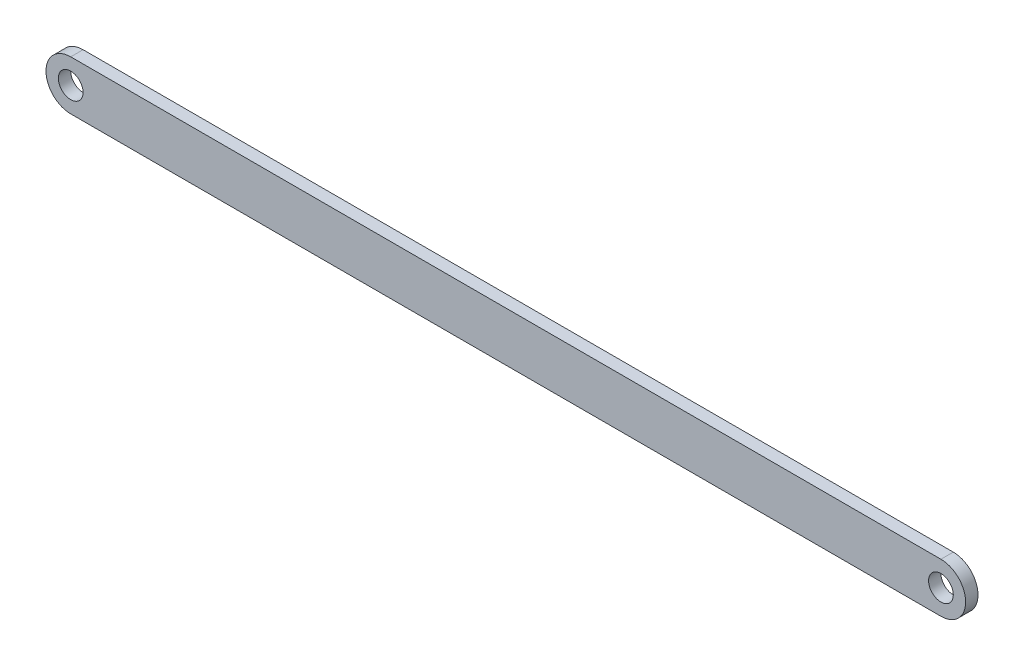
ISO-10303-21;
HEADER;
FILE_DESCRIPTION(('STEP AP214'),'2;1');
FILE_NAME('part.step','',(''),(''),'','','');
FILE_SCHEMA(('AUTOMOTIVE_DESIGN { 1 0 10303 214 1 1 1 1 }'));
ENDSEC;
DATA;
#1=APPLICATION_CONTEXT('core data for automotive mechanical design processes');
#2=APPLICATION_PROTOCOL_DEFINITION('international standard','automotive_design',2000,#1);
#3=PRODUCT_CONTEXT('',#1,'mechanical');
#4=PRODUCT('Part','Part','',(#3));
#5=PRODUCT_RELATED_PRODUCT_CATEGORY('part','',(#4));
#6=PRODUCT_DEFINITION_FORMATION('','',#4);
#7=PRODUCT_DEFINITION_CONTEXT('part definition',#1,'design');
#8=PRODUCT_DEFINITION('design','',#6,#7);
#9=PRODUCT_DEFINITION_SHAPE('','',#8);
#10=(LENGTH_UNIT() NAMED_UNIT(*) SI_UNIT(.MILLI.,.METRE.));
#11=(NAMED_UNIT(*) PLANE_ANGLE_UNIT() SI_UNIT($,.RADIAN.));
#12=(NAMED_UNIT(*) SI_UNIT($,.STERADIAN.) SOLID_ANGLE_UNIT());
#13=UNCERTAINTY_MEASURE_WITH_UNIT(LENGTH_MEASURE(1.E-05),#10,'distance_accuracy_value','');
#14=(GEOMETRIC_REPRESENTATION_CONTEXT(3) GLOBAL_UNCERTAINTY_ASSIGNED_CONTEXT((#13)) GLOBAL_UNIT_ASSIGNED_CONTEXT((#10,
#11,#12)) REPRESENTATION_CONTEXT('',''));
#15=CARTESIAN_POINT('',(0.,0.,0.));
#16=DIRECTION('',(0.,0.,1.));
#17=DIRECTION('',(1.,0.,0.));
#18=AXIS2_PLACEMENT_3D('',#15,#16,#17);
#19=CARTESIAN_POINT('',(35.21,0.,1.));
#20=DIRECTION('',(0.,0.,-1.));
#21=DIRECTION('',(-1.,0.,0.));
#22=AXIS2_PLACEMENT_3D('',#19,#20,#21);
#23=PLANE('',#22);
#24=CARTESIAN_POINT('',(35.21,0.,1.));
#25=DIRECTION('',(0.,0.,1.));
#26=DIRECTION('',(-1.,0.,0.));
#27=AXIS2_PLACEMENT_3D('',#24,#25,#26);
#28=CIRCLE('',#27,2.);
#29=CARTESIAN_POINT('',(35.21,-2.,1.));
#30=VERTEX_POINT('',#29);
#31=CARTESIAN_POINT('',(35.21,2.,1.));
#32=VERTEX_POINT('',#31);
#33=EDGE_CURVE('E92',#30,#32,#28,.T.);
#34=ORIENTED_EDGE('',*,*,#33,.T.);
#35=DIRECTION('',(-1.,0.,0.));
#36=VECTOR('',#35,1.);
#37=CARTESIAN_POINT('',(-35.21,2.,1.));
#38=LINE('',#37,#36);
#39=CARTESIAN_POINT('',(-35.21,2.,1.));
#40=VERTEX_POINT('',#39);
#41=EDGE_CURVE('E87',#32,#40,#38,.T.);
#42=ORIENTED_EDGE('',*,*,#41,.T.);
#43=CARTESIAN_POINT('',(-35.21,0.,1.));
#44=DIRECTION('',(0.,0.,1.));
#45=DIRECTION('',(1.,0.,0.));
#46=AXIS2_PLACEMENT_3D('',#43,#44,#45);
#47=CIRCLE('',#46,2.);
#48=CARTESIAN_POINT('',(-35.21,-2.,1.));
#49=VERTEX_POINT('',#48);
#50=EDGE_CURVE('E90',#40,#49,#47,.T.);
#51=ORIENTED_EDGE('',*,*,#50,.T.);
#52=DIRECTION('',(1.,0.,0.));
#53=VECTOR('',#52,1.);
#54=CARTESIAN_POINT('',(-35.21,-2.,1.));
#55=LINE('',#54,#53);
#56=EDGE_CURVE('E57',#49,#30,#55,.T.);
#57=ORIENTED_EDGE('',*,*,#56,.T.);
#58=EDGE_LOOP('',(#34,#42,#51,#57));
#59=FACE_BOUND('',#58,.T.);
#60=CARTESIAN_POINT('',(-35.21,0.,1.));
#61=DIRECTION('',(0.,0.,1.));
#62=DIRECTION('',(1.,0.,0.));
#63=AXIS2_PLACEMENT_3D('',#60,#61,#62);
#64=CIRCLE('',#63,0.999999999999998);
#65=CARTESIAN_POINT('',(-34.21,0.,1.));
#66=VERTEX_POINT('',#65);
#67=EDGE_CURVE('E107',#66,#66,#64,.T.);
#68=ORIENTED_EDGE('',*,*,#67,.F.);
#69=EDGE_LOOP('',(#68));
#70=FACE_BOUND('',#69,.T.);
#71=CARTESIAN_POINT('',(35.21,0.,1.));
#72=DIRECTION('',(0.,0.,1.));
#73=DIRECTION('',(1.,0.,0.));
#74=AXIS2_PLACEMENT_3D('',#71,#72,#73);
#75=CIRCLE('',#74,0.999999999999998);
#76=CARTESIAN_POINT('',(36.21,0.,1.));
#77=VERTEX_POINT('',#76);
#78=EDGE_CURVE('E122',#77,#77,#75,.T.);
#79=ORIENTED_EDGE('',*,*,#78,.F.);
#80=EDGE_LOOP('',(#79));
#81=FACE_BOUND('',#80,.T.);
#82=ADVANCED_FACE('F40',(#59,#70,#81),#23,.F.);
#83=CARTESIAN_POINT('',(35.21,0.,0.));
#84=DIRECTION('',(0.,0.,-1.));
#85=DIRECTION('',(-1.,0.,0.));
#86=AXIS2_PLACEMENT_3D('',#83,#84,#85);
#87=PLANE('',#86);
#88=CARTESIAN_POINT('',(-35.21,0.,0.));
#89=DIRECTION('',(0.,0.,1.));
#90=DIRECTION('',(1.,0.,0.));
#91=AXIS2_PLACEMENT_3D('',#88,#89,#90);
#92=CIRCLE('',#91,0.999999999999998);
#93=CARTESIAN_POINT('',(-34.21,0.,0.));
#94=VERTEX_POINT('',#93);
#95=EDGE_CURVE('E119',#94,#94,#92,.T.);
#96=ORIENTED_EDGE('',*,*,#95,.T.);
#97=EDGE_LOOP('',(#96));
#98=FACE_BOUND('',#97,.T.);
#99=CARTESIAN_POINT('',(35.21,0.,0.));
#100=DIRECTION('',(0.,0.,1.));
#101=DIRECTION('',(-1.,0.,0.));
#102=AXIS2_PLACEMENT_3D('',#99,#100,#101);
#103=CIRCLE('',#102,2.);
#104=CARTESIAN_POINT('',(35.21,-2.,0.));
#105=VERTEX_POINT('',#104);
#106=CARTESIAN_POINT('',(35.21,2.,0.));
#107=VERTEX_POINT('',#106);
#108=EDGE_CURVE('E104',#105,#107,#103,.T.);
#109=ORIENTED_EDGE('',*,*,#108,.F.);
#110=DIRECTION('',(1.,0.,0.));
#111=VECTOR('',#110,1.);
#112=CARTESIAN_POINT('',(-35.21,-2.,0.));
#113=LINE('',#112,#111);
#114=CARTESIAN_POINT('',(-35.21,-2.,0.));
#115=VERTEX_POINT('',#114);
#116=EDGE_CURVE('E80',#115,#105,#113,.T.);
#117=ORIENTED_EDGE('',*,*,#116,.F.);
#118=CARTESIAN_POINT('',(-35.21,0.,0.));
#119=DIRECTION('',(0.,0.,1.));
#120=DIRECTION('',(1.,0.,0.));
#121=AXIS2_PLACEMENT_3D('',#118,#119,#120);
#122=CIRCLE('',#121,2.);
#123=CARTESIAN_POINT('',(-35.21,2.,0.));
#124=VERTEX_POINT('',#123);
#125=EDGE_CURVE('E74',#124,#115,#122,.T.);
#126=ORIENTED_EDGE('',*,*,#125,.F.);
#127=DIRECTION('',(-1.,0.,0.));
#128=VECTOR('',#127,1.);
#129=CARTESIAN_POINT('',(-35.21,2.,0.));
#130=LINE('',#129,#128);
#131=EDGE_CURVE('E96',#107,#124,#130,.T.);
#132=ORIENTED_EDGE('',*,*,#131,.F.);
#133=EDGE_LOOP('',(#109,#117,#126,#132));
#134=FACE_BOUND('',#133,.T.);
#135=CARTESIAN_POINT('',(35.21,0.,0.));
#136=DIRECTION('',(0.,0.,1.));
#137=DIRECTION('',(1.,0.,0.));
#138=AXIS2_PLACEMENT_3D('',#135,#136,#137);
#139=CIRCLE('',#138,0.999999999999998);
#140=CARTESIAN_POINT('',(36.21,0.,0.));
#141=VERTEX_POINT('',#140);
#142=EDGE_CURVE('E125',#141,#141,#139,.T.);
#143=ORIENTED_EDGE('',*,*,#142,.T.);
#144=EDGE_LOOP('',(#143));
#145=FACE_BOUND('',#144,.T.);
#146=ADVANCED_FACE('F115',(#98,#134,#145),#87,.T.);
#147=CARTESIAN_POINT('',(35.21,0.,1.));
#148=DIRECTION('',(0.,0.,-1.));
#149=DIRECTION('',(-1.,0.,0.));
#150=AXIS2_PLACEMENT_3D('',#147,#148,#149);
#151=CYLINDRICAL_SURFACE('',#150,2.);
#152=ORIENTED_EDGE('',*,*,#108,.T.);
#153=DIRECTION('',(0.,0.,-1.));
#154=VECTOR('',#153,1.);
#155=CARTESIAN_POINT('',(35.21,2.,1.));
#156=LINE('',#155,#154);
#157=EDGE_CURVE('E11',#32,#107,#156,.T.);
#158=ORIENTED_EDGE('',*,*,#157,.F.);
#159=ORIENTED_EDGE('',*,*,#33,.F.);
#160=DIRECTION('',(0.,0.,-1.));
#161=VECTOR('',#160,1.);
#162=CARTESIAN_POINT('',(35.21,-2.,1.));
#163=LINE('',#162,#161);
#164=EDGE_CURVE('E100',#30,#105,#163,.T.);
#165=ORIENTED_EDGE('',*,*,#164,.T.);
#166=EDGE_LOOP('',(#152,#158,#159,#165));
#167=FACE_BOUND('',#166,.T.);
#168=ADVANCED_FACE('F42',(#167),#151,.T.);
#169=CARTESIAN_POINT('',(-35.21,2.,1.));
#170=DIRECTION('',(0.,-1.,0.));
#171=DIRECTION('',(0.,0.,-1.));
#172=AXIS2_PLACEMENT_3D('',#169,#170,#171);
#173=PLANE('',#172);
#174=ORIENTED_EDGE('',*,*,#131,.T.);
#175=DIRECTION('',(0.,0.,-1.));
#176=VECTOR('',#175,1.);
#177=CARTESIAN_POINT('',(-35.21,2.,1.));
#178=LINE('',#177,#176);
#179=EDGE_CURVE('E49',#40,#124,#178,.T.);
#180=ORIENTED_EDGE('',*,*,#179,.F.);
#181=ORIENTED_EDGE('',*,*,#41,.F.);
#182=ORIENTED_EDGE('',*,*,#157,.T.);
#183=EDGE_LOOP('',(#174,#180,#181,#182));
#184=FACE_BOUND('',#183,.T.);
#185=ADVANCED_FACE('F95',(#184),#173,.F.);
#186=CARTESIAN_POINT('',(-35.21,0.,1.));
#187=DIRECTION('',(0.,0.,-1.));
#188=DIRECTION('',(-1.,0.,0.));
#189=AXIS2_PLACEMENT_3D('',#186,#187,#188);
#190=CYLINDRICAL_SURFACE('',#189,2.);
#191=ORIENTED_EDGE('',*,*,#125,.T.);
#192=DIRECTION('',(0.,0.,-1.));
#193=VECTOR('',#192,1.);
#194=CARTESIAN_POINT('',(-35.21,-2.,1.));
#195=LINE('',#194,#193);
#196=EDGE_CURVE('E97',#49,#115,#195,.T.);
#197=ORIENTED_EDGE('',*,*,#196,.F.);
#198=ORIENTED_EDGE('',*,*,#50,.F.);
#199=ORIENTED_EDGE('',*,*,#179,.T.);
#200=EDGE_LOOP('',(#191,#197,#198,#199));
#201=FACE_BOUND('',#200,.T.);
#202=ADVANCED_FACE('F98',(#201),#190,.T.);
#203=CARTESIAN_POINT('',(-35.21,-2.,1.));
#204=DIRECTION('',(0.,1.,0.));
#205=DIRECTION('',(0.,0.,1.));
#206=AXIS2_PLACEMENT_3D('',#203,#204,#205);
#207=PLANE('',#206);
#208=ORIENTED_EDGE('',*,*,#116,.T.);
#209=ORIENTED_EDGE('',*,*,#164,.F.);
#210=ORIENTED_EDGE('',*,*,#56,.F.);
#211=ORIENTED_EDGE('',*,*,#196,.T.);
#212=EDGE_LOOP('',(#208,#209,#210,#211));
#213=FACE_BOUND('',#212,.T.);
#214=ADVANCED_FACE('F112',(#213),#207,.F.);
#215=CARTESIAN_POINT('',(-35.21,0.,1.));
#216=DIRECTION('',(0.,0.,-1.));
#217=DIRECTION('',(-1.,0.,0.));
#218=AXIS2_PLACEMENT_3D('',#215,#216,#217);
#219=CYLINDRICAL_SURFACE('',#218,0.999999999999998);
#220=ORIENTED_EDGE('',*,*,#67,.T.);
#221=EDGE_LOOP('',(#220));
#222=FACE_BOUND('',#221,.T.);
#223=ORIENTED_EDGE('',*,*,#95,.F.);
#224=EDGE_LOOP('',(#223));
#225=FACE_BOUND('',#224,.T.);
#226=ADVANCED_FACE('F142',(#222,#225),#219,.F.);
#227=CARTESIAN_POINT('',(35.21,0.,1.));
#228=DIRECTION('',(0.,0.,-1.));
#229=DIRECTION('',(-1.,0.,0.));
#230=AXIS2_PLACEMENT_3D('',#227,#228,#229);
#231=CYLINDRICAL_SURFACE('',#230,0.999999999999998);
#232=ORIENTED_EDGE('',*,*,#78,.T.);
#233=EDGE_LOOP('',(#232));
#234=FACE_BOUND('',#233,.T.);
#235=ORIENTED_EDGE('',*,*,#142,.F.);
#236=EDGE_LOOP('',(#235));
#237=FACE_BOUND('',#236,.T.);
#238=ADVANCED_FACE('F131',(#234,#237),#231,.F.);
#239=CLOSED_SHELL('',(#82,#146,#168,#185,#202,#214,#226,#238));
#240=MANIFOLD_SOLID_BREP('B2',#239);
#241=ADVANCED_BREP_SHAPE_REPRESENTATION('',(#18,#240),#14);
#242=SHAPE_DEFINITION_REPRESENTATION(#9,#241);
ENDSEC;
END-ISO-10303-21;
